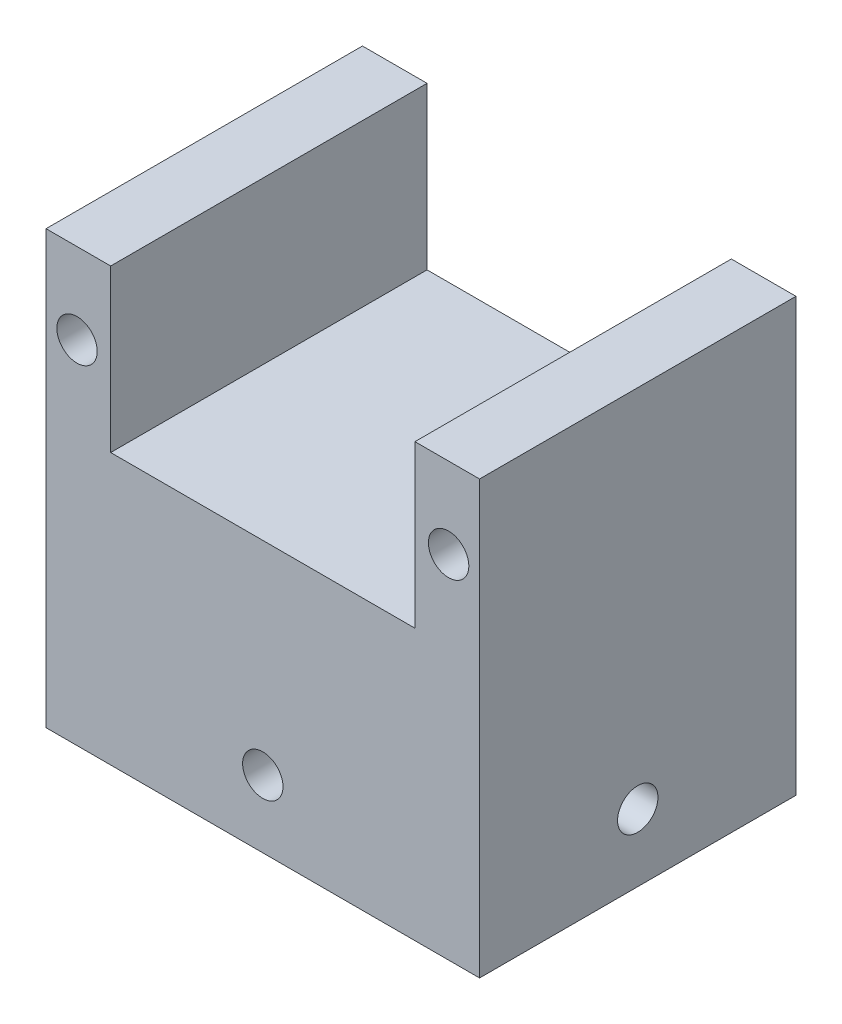
ISO-10303-21;
HEADER;
FILE_DESCRIPTION(('STEP AP214'),'2;1');
FILE_NAME('part.step','',(''),(''),'','','');
FILE_SCHEMA(('AUTOMOTIVE_DESIGN { 1 0 10303 214 1 1 1 1 }'));
ENDSEC;
DATA;
#1=APPLICATION_CONTEXT('core data for automotive mechanical design processes');
#2=APPLICATION_PROTOCOL_DEFINITION('international standard','automotive_design',2000,#1);
#3=PRODUCT_CONTEXT('',#1,'mechanical');
#4=PRODUCT('Part','Part','',(#3));
#5=PRODUCT_RELATED_PRODUCT_CATEGORY('part','',(#4));
#6=PRODUCT_DEFINITION_FORMATION('','',#4);
#7=PRODUCT_DEFINITION_CONTEXT('part definition',#1,'design');
#8=PRODUCT_DEFINITION('design','',#6,#7);
#9=PRODUCT_DEFINITION_SHAPE('','',#8);
#10=(LENGTH_UNIT() NAMED_UNIT(*) SI_UNIT(.MILLI.,.METRE.));
#11=(NAMED_UNIT(*) PLANE_ANGLE_UNIT() SI_UNIT($,.RADIAN.));
#12=(NAMED_UNIT(*) SI_UNIT($,.STERADIAN.) SOLID_ANGLE_UNIT());
#13=UNCERTAINTY_MEASURE_WITH_UNIT(LENGTH_MEASURE(1.E-05),#10,'distance_accuracy_value','');
#14=(GEOMETRIC_REPRESENTATION_CONTEXT(3) GLOBAL_UNCERTAINTY_ASSIGNED_CONTEXT((#13)) GLOBAL_UNIT_ASSIGNED_CONTEXT((#10,
#11,#12)) REPRESENTATION_CONTEXT('',''));
#15=CARTESIAN_POINT('',(0.,0.,0.));
#16=DIRECTION('',(0.,0.,1.));
#17=DIRECTION('',(1.,0.,0.));
#18=AXIS2_PLACEMENT_3D('',#15,#16,#17);
#19=CARTESIAN_POINT('',(5.23104693140794,5.,22.5678700361011));
#20=DIRECTION('',(0.,0.,-1.));
#21=DIRECTION('',(-1.,0.,0.));
#22=AXIS2_PLACEMENT_3D('',#19,#20,#21);
#23=CYLINDRICAL_SURFACE('',#22,1.5);
#24=CARTESIAN_POINT('',(5.23104693140794,5.,-9.53212996389891));
#25=DIRECTION('',(0.,0.,-1.));
#26=DIRECTION('',(-1.,0.,0.));
#27=AXIS2_PLACEMENT_3D('',#24,#25,#26);
#28=CIRCLE('',#27,1.5);
#29=CARTESIAN_POINT('',(3.73104693140794,5.,-9.53212996389891));
#30=VERTEX_POINT('',#29);
#31=EDGE_CURVE('E189',#30,#30,#28,.T.);
#32=ORIENTED_EDGE('',*,*,#31,.T.);
#33=EDGE_LOOP('',(#32));
#34=FACE_BOUND('',#33,.T.);
#35=CARTESIAN_POINT('',(5.23104693140794,5.,2.21787003610109));
#36=DIRECTION('',(0.707106781186547,0.,-0.707106781186547));
#37=DIRECTION('',(-0.707106781186548,0.,-0.707106781186547));
#38=AXIS2_PLACEMENT_3D('',#35,#36,#37);
#39=ELLIPSE('',#38,2.12132034355964,1.5);
#40=CARTESIAN_POINT('',(5.23104693140794,6.5,2.21787003610109));
#41=VERTEX_POINT('',#40);
#42=CARTESIAN_POINT('',(5.23104693140794,3.5,2.21787003610109));
#43=VERTEX_POINT('',#42);
#44=EDGE_CURVE('E46',#41,#43,#39,.F.);
#45=ORIENTED_EDGE('',*,*,#44,.T.);
#46=CARTESIAN_POINT('',(5.23104693140794,5.,2.21787003610109));
#47=DIRECTION('',(-0.707106781186548,0.,-0.707106781186547));
#48=DIRECTION('',(0.707106781186547,0.,-0.707106781186547));
#49=AXIS2_PLACEMENT_3D('',#46,#47,#48);
#50=ELLIPSE('',#49,2.12132034355964,1.5);
#51=EDGE_CURVE('E11',#43,#41,#50,.F.);
#52=ORIENTED_EDGE('',*,*,#51,.T.);
#53=EDGE_LOOP('',(#45,#52));
#54=FACE_BOUND('',#53,.T.);
#55=ADVANCED_FACE('F33',(#34,#54),#23,.F.);
#56=CARTESIAN_POINT('',(0.,32.1,0.));
#57=DIRECTION('',(0.,1.,0.));
#58=DIRECTION('',(0.,0.,1.));
#59=AXIS2_PLACEMENT_3D('',#56,#57,#58);
#60=PLANE('',#59);
#61=DIRECTION('',(0.,0.,-1.));
#62=VECTOR('',#61,1.);
#63=CARTESIAN_POINT('',(16.5310469314079,32.1,0.));
#64=LINE('',#63,#62);
#65=CARTESIAN_POINT('',(16.5310469314079,32.1,13.9678700361011));
#66=VERTEX_POINT('',#65);
#67=CARTESIAN_POINT('',(16.5310469314079,32.1,-9.53212996389891));
#68=VERTEX_POINT('',#67);
#69=EDGE_CURVE('E112',#66,#68,#64,.T.);
#70=ORIENTED_EDGE('',*,*,#69,.F.);
#71=DIRECTION('',(1.,0.,0.));
#72=VECTOR('',#71,1.);
#73=CARTESIAN_POINT('',(-10.8689530685921,32.1,13.9678700361011));
#74=LINE('',#73,#72);
#75=CARTESIAN_POINT('',(21.3310469314079,32.1,13.9678700361011));
#76=VERTEX_POINT('',#75);
#77=EDGE_CURVE('E152',#66,#76,#74,.T.);
#78=ORIENTED_EDGE('',*,*,#77,.T.);
#79=DIRECTION('',(0.,0.,-1.));
#80=VECTOR('',#79,1.);
#81=CARTESIAN_POINT('',(21.3310469314079,32.1,-9.53212996389891));
#82=LINE('',#81,#80);
#83=CARTESIAN_POINT('',(21.3310469314079,32.1,-9.53212996389891));
#84=VERTEX_POINT('',#83);
#85=EDGE_CURVE('E147',#76,#84,#82,.T.);
#86=ORIENTED_EDGE('',*,*,#85,.T.);
#87=DIRECTION('',(-1.,0.,0.));
#88=VECTOR('',#87,1.);
#89=CARTESIAN_POINT('',(-10.8689530685921,32.1,-9.53212996389891));
#90=LINE('',#89,#88);
#91=EDGE_CURVE('E132',#84,#68,#90,.T.);
#92=ORIENTED_EDGE('',*,*,#91,.T.);
#93=EDGE_LOOP('',(#70,#78,#86,#92));
#94=FACE_BOUND('',#93,.T.);
#95=ADVANCED_FACE('F203',(#94),#60,.T.);
#96=CARTESIAN_POINT('',(-10.8689530685921,32.1,-9.53212996389891));
#97=DIRECTION('',(1.,0.,0.));
#98=DIRECTION('',(0.,0.,-1.));
#99=AXIS2_PLACEMENT_3D('',#96,#97,#98);
#100=PLANE('',#99);
#101=CARTESIAN_POINT('',(-10.8689530685921,5.,2.21787003610109));
#102=DIRECTION('',(-1.,0.,0.));
#103=DIRECTION('',(0.,0.,1.));
#104=AXIS2_PLACEMENT_3D('',#101,#102,#103);
#105=CIRCLE('',#104,1.5);
#106=CARTESIAN_POINT('',(-10.8689530685921,5.,3.71787003610109));
#107=VERTEX_POINT('',#106);
#108=EDGE_CURVE('E195',#107,#107,#105,.T.);
#109=ORIENTED_EDGE('',*,*,#108,.F.);
#110=EDGE_LOOP('',(#109));
#111=FACE_BOUND('',#110,.T.);
#112=DIRECTION('',(0.,0.,1.));
#113=VECTOR('',#112,1.);
#114=CARTESIAN_POINT('',(-10.8689530685921,0.,-9.53212996389891));
#115=LINE('',#114,#113);
#116=CARTESIAN_POINT('',(-10.8689530685921,0.,-9.53212996389891));
#117=VERTEX_POINT('',#116);
#118=CARTESIAN_POINT('',(-10.8689530685921,0.,13.9678700361011));
#119=VERTEX_POINT('',#118);
#120=EDGE_CURVE('E140',#117,#119,#115,.T.);
#121=ORIENTED_EDGE('',*,*,#120,.T.);
#122=DIRECTION('',(0.,-1.,0.));
#123=VECTOR('',#122,1.);
#124=CARTESIAN_POINT('',(-10.8689530685921,32.1,13.9678700361011));
#125=LINE('',#124,#123);
#126=CARTESIAN_POINT('',(-10.8689530685921,32.1,13.9678700361011));
#127=VERTEX_POINT('',#126);
#128=EDGE_CURVE('E120',#127,#119,#125,.T.);
#129=ORIENTED_EDGE('',*,*,#128,.F.);
#130=DIRECTION('',(0.,0.,1.));
#131=VECTOR('',#130,1.);
#132=CARTESIAN_POINT('',(-10.8689530685921,32.1,-9.53212996389891));
#133=LINE('',#132,#131);
#134=CARTESIAN_POINT('',(-10.8689530685921,32.1,-9.53212996389891));
#135=VERTEX_POINT('',#134);
#136=EDGE_CURVE('E135',#135,#127,#133,.T.);
#137=ORIENTED_EDGE('',*,*,#136,.F.);
#138=DIRECTION('',(0.,-1.,0.));
#139=VECTOR('',#138,1.);
#140=CARTESIAN_POINT('',(-10.8689530685921,32.1,-9.53212996389891));
#141=LINE('',#140,#139);
#142=EDGE_CURVE('E129',#135,#117,#141,.T.);
#143=ORIENTED_EDGE('',*,*,#142,.T.);
#144=EDGE_LOOP('',(#121,#129,#137,#143));
#145=FACE_BOUND('',#144,.T.);
#146=ADVANCED_FACE('F35',(#111,#145),#100,.F.);
#147=CARTESIAN_POINT('',(-10.8689530685921,32.1,13.9678700361011));
#148=DIRECTION('',(0.,0.,-1.));
#149=DIRECTION('',(-1.,0.,0.));
#150=AXIS2_PLACEMENT_3D('',#147,#148,#149);
#151=PLANE('',#150);
#152=CARTESIAN_POINT('',(5.23104693140794,5.,13.9678700361011));
#153=DIRECTION('',(0.,0.,-1.));
#154=DIRECTION('',(-1.,0.,0.));
#155=AXIS2_PLACEMENT_3D('',#152,#153,#154);
#156=CIRCLE('',#155,1.5);
#157=CARTESIAN_POINT('',(3.73104693140794,5.,13.9678700361011));
#158=VERTEX_POINT('',#157);
#159=EDGE_CURVE('E186',#158,#158,#156,.T.);
#160=ORIENTED_EDGE('',*,*,#159,.T.);
#161=EDGE_LOOP('',(#160));
#162=FACE_BOUND('',#161,.T.);
#163=CARTESIAN_POINT('',(19.0310469314079,26.1,13.9678700361011));
#164=DIRECTION('',(0.,0.,-1.));
#165=DIRECTION('',(-1.,0.,0.));
#166=AXIS2_PLACEMENT_3D('',#163,#164,#165);
#167=CIRCLE('',#166,1.5);
#168=CARTESIAN_POINT('',(17.5310469314079,26.1,13.9678700361011));
#169=VERTEX_POINT('',#168);
#170=EDGE_CURVE('E180',#169,#169,#167,.T.);
#171=ORIENTED_EDGE('',*,*,#170,.T.);
#172=EDGE_LOOP('',(#171));
#173=FACE_BOUND('',#172,.T.);
#174=CARTESIAN_POINT('',(-8.56895306859206,26.1,13.9678700361011));
#175=DIRECTION('',(0.,0.,-1.));
#176=DIRECTION('',(-1.,0.,0.));
#177=AXIS2_PLACEMENT_3D('',#174,#175,#176);
#178=CIRCLE('',#177,1.5);
#179=CARTESIAN_POINT('',(-10.0689530685921,26.1,13.9678700361011));
#180=VERTEX_POINT('',#179);
#181=EDGE_CURVE('E174',#180,#180,#178,.T.);
#182=ORIENTED_EDGE('',*,*,#181,.T.);
#183=EDGE_LOOP('',(#182));
#184=FACE_BOUND('',#183,.T.);
#185=ORIENTED_EDGE('',*,*,#77,.F.);
#186=DIRECTION('',(0.,-1.,0.));
#187=VECTOR('',#186,1.);
#188=CARTESIAN_POINT('',(16.5310469314079,32.1,13.9678700361011));
#189=LINE('',#188,#187);
#190=CARTESIAN_POINT('',(16.5310469314079,20.1,13.9678700361011));
#191=VERTEX_POINT('',#190);
#192=EDGE_CURVE('E157',#66,#191,#189,.T.);
#193=ORIENTED_EDGE('',*,*,#192,.T.);
#194=DIRECTION('',(-1.,0.,0.));
#195=VECTOR('',#194,1.);
#196=CARTESIAN_POINT('',(-10.8689530685921,20.1,13.9678700361011));
#197=LINE('',#196,#195);
#198=CARTESIAN_POINT('',(-6.06895306859206,20.1,13.9678700361011));
#199=VERTEX_POINT('',#198);
#200=EDGE_CURVE('E143',#191,#199,#197,.T.);
#201=ORIENTED_EDGE('',*,*,#200,.T.);
#202=DIRECTION('',(0.,1.,0.));
#203=VECTOR('',#202,1.);
#204=CARTESIAN_POINT('',(-6.06895306859205,32.1,13.9678700361011));
#205=LINE('',#204,#203);
#206=CARTESIAN_POINT('',(-6.06895306859205,32.1,13.9678700361011));
#207=VERTEX_POINT('',#206);
#208=EDGE_CURVE('E160',#199,#207,#205,.T.);
#209=ORIENTED_EDGE('',*,*,#208,.T.);
#210=EDGE_CURVE('E149',#127,#207,#74,.T.);
#211=ORIENTED_EDGE('',*,*,#210,.F.);
#212=ORIENTED_EDGE('',*,*,#128,.T.);
#213=DIRECTION('',(1.,0.,0.));
#214=VECTOR('',#213,1.);
#215=CARTESIAN_POINT('',(-10.8689530685921,0.,13.9678700361011));
#216=LINE('',#215,#214);
#217=CARTESIAN_POINT('',(21.3310469314079,0.,13.9678700361011));
#218=VERTEX_POINT('',#217);
#219=EDGE_CURVE('E138',#119,#218,#216,.T.);
#220=ORIENTED_EDGE('',*,*,#219,.T.);
#221=DIRECTION('',(0.,-1.,0.));
#222=VECTOR('',#221,1.);
#223=CARTESIAN_POINT('',(21.3310469314079,32.1,13.9678700361011));
#224=LINE('',#223,#222);
#225=EDGE_CURVE('E123',#76,#218,#224,.T.);
#226=ORIENTED_EDGE('',*,*,#225,.F.);
#227=EDGE_LOOP('',(#185,#193,#201,#209,#211,#212,#220,#226));
#228=FACE_BOUND('',#227,.T.);
#229=ADVANCED_FACE('F202',(#162,#173,#184,#228),#151,.F.);
#230=CARTESIAN_POINT('',(21.3310469314079,32.1,-9.53212996389891));
#231=DIRECTION('',(-1.,0.,0.));
#232=DIRECTION('',(0.,0.,1.));
#233=AXIS2_PLACEMENT_3D('',#230,#231,#232);
#234=PLANE('',#233);
#235=CARTESIAN_POINT('',(21.3310469314079,5.,2.21787003610108));
#236=DIRECTION('',(-1.,0.,0.));
#237=DIRECTION('',(0.,0.,1.));
#238=AXIS2_PLACEMENT_3D('',#235,#236,#237);
#239=CIRCLE('',#238,1.5);
#240=CARTESIAN_POINT('',(21.3310469314079,5.,3.71787003610108));
#241=VERTEX_POINT('',#240);
#242=EDGE_CURVE('E192',#241,#241,#239,.T.);
#243=ORIENTED_EDGE('',*,*,#242,.T.);
#244=EDGE_LOOP('',(#243));
#245=FACE_BOUND('',#244,.T.);
#246=DIRECTION('',(0.,0.,-1.));
#247=VECTOR('',#246,1.);
#248=CARTESIAN_POINT('',(21.3310469314079,0.,-9.53212996389891));
#249=LINE('',#248,#247);
#250=CARTESIAN_POINT('',(21.3310469314079,0.,-9.53212996389891));
#251=VERTEX_POINT('',#250);
#252=EDGE_CURVE('E136',#218,#251,#249,.T.);
#253=ORIENTED_EDGE('',*,*,#252,.T.);
#254=DIRECTION('',(0.,-1.,0.));
#255=VECTOR('',#254,1.);
#256=CARTESIAN_POINT('',(21.3310469314079,32.1,-9.53212996389891));
#257=LINE('',#256,#255);
#258=EDGE_CURVE('E126',#84,#251,#257,.T.);
#259=ORIENTED_EDGE('',*,*,#258,.F.);
#260=ORIENTED_EDGE('',*,*,#85,.F.);
#261=ORIENTED_EDGE('',*,*,#225,.T.);
#262=EDGE_LOOP('',(#253,#259,#260,#261));
#263=FACE_BOUND('',#262,.T.);
#264=ADVANCED_FACE('F226',(#245,#263),#234,.F.);
#265=CARTESIAN_POINT('',(-10.8689530685921,32.1,-9.53212996389891));
#266=DIRECTION('',(0.,0.,1.));
#267=DIRECTION('',(1.,0.,0.));
#268=AXIS2_PLACEMENT_3D('',#265,#266,#267);
#269=PLANE('',#268);
#270=ORIENTED_EDGE('',*,*,#31,.F.);
#271=EDGE_LOOP('',(#270));
#272=FACE_BOUND('',#271,.T.);
#273=CARTESIAN_POINT('',(19.0310469314079,26.1,-9.53212996389891));
#274=DIRECTION('',(0.,0.,-1.));
#275=DIRECTION('',(-1.,0.,0.));
#276=AXIS2_PLACEMENT_3D('',#273,#274,#275);
#277=CIRCLE('',#276,1.5);
#278=CARTESIAN_POINT('',(17.5310469314079,26.1,-9.53212996389891));
#279=VERTEX_POINT('',#278);
#280=EDGE_CURVE('E183',#279,#279,#277,.T.);
#281=ORIENTED_EDGE('',*,*,#280,.F.);
#282=EDGE_LOOP('',(#281));
#283=FACE_BOUND('',#282,.T.);
#284=CARTESIAN_POINT('',(-8.56895306859206,26.1,-9.53212996389891));
#285=DIRECTION('',(0.,0.,-1.));
#286=DIRECTION('',(-1.,0.,0.));
#287=AXIS2_PLACEMENT_3D('',#284,#285,#286);
#288=CIRCLE('',#287,1.5);
#289=CARTESIAN_POINT('',(-10.0689530685921,26.1,-9.53212996389891));
#290=VERTEX_POINT('',#289);
#291=EDGE_CURVE('E177',#290,#290,#288,.T.);
#292=ORIENTED_EDGE('',*,*,#291,.F.);
#293=EDGE_LOOP('',(#292));
#294=FACE_BOUND('',#293,.T.);
#295=DIRECTION('',(-1.,0.,0.));
#296=VECTOR('',#295,1.);
#297=CARTESIAN_POINT('',(16.5310469314079,20.1,-9.53212996389891));
#298=LINE('',#297,#296);
#299=CARTESIAN_POINT('',(16.5310469314079,20.1,-9.53212996389891));
#300=VERTEX_POINT('',#299);
#301=CARTESIAN_POINT('',(-6.06895306859206,20.1,-9.53212996389891));
#302=VERTEX_POINT('',#301);
#303=EDGE_CURVE('E168',#300,#302,#298,.T.);
#304=ORIENTED_EDGE('',*,*,#303,.F.);
#305=DIRECTION('',(0.,-1.,0.));
#306=VECTOR('',#305,1.);
#307=CARTESIAN_POINT('',(16.5310469314079,32.1,-9.53212996389891));
#308=LINE('',#307,#306);
#309=EDGE_CURVE('E171',#68,#300,#308,.T.);
#310=ORIENTED_EDGE('',*,*,#309,.F.);
#311=ORIENTED_EDGE('',*,*,#91,.F.);
#312=ORIENTED_EDGE('',*,*,#258,.T.);
#313=DIRECTION('',(-1.,0.,0.));
#314=VECTOR('',#313,1.);
#315=CARTESIAN_POINT('',(-10.8689530685921,0.,-9.53212996389891));
#316=LINE('',#315,#314);
#317=EDGE_CURVE('E133',#251,#117,#316,.T.);
#318=ORIENTED_EDGE('',*,*,#317,.T.);
#319=ORIENTED_EDGE('',*,*,#142,.F.);
#320=CARTESIAN_POINT('',(-6.06895306859206,32.1,-9.53212996389891));
#321=VERTEX_POINT('',#320);
#322=EDGE_CURVE('E146',#321,#135,#90,.T.);
#323=ORIENTED_EDGE('',*,*,#322,.F.);
#324=DIRECTION('',(0.,1.,0.));
#325=VECTOR('',#324,1.);
#326=CARTESIAN_POINT('',(-6.06895306859205,32.1,-9.53212996389891));
#327=LINE('',#326,#325);
#328=EDGE_CURVE('E54',#302,#321,#327,.T.);
#329=ORIENTED_EDGE('',*,*,#328,.F.);
#330=EDGE_LOOP('',(#304,#310,#311,#312,#318,#319,#323,#329));
#331=FACE_BOUND('',#330,.T.);
#332=ADVANCED_FACE('F220',(#272,#283,#294,#331),#269,.F.);
#333=DIRECTION('',(0.,0.,1.));
#334=VECTOR('',#333,1.);
#335=CARTESIAN_POINT('',(-6.06895306859205,32.1,0.));
#336=LINE('',#335,#334);
#337=EDGE_CURVE('E118',#321,#207,#336,.T.);
#338=ORIENTED_EDGE('',*,*,#337,.F.);
#339=ORIENTED_EDGE('',*,*,#322,.T.);
#340=ORIENTED_EDGE('',*,*,#136,.T.);
#341=ORIENTED_EDGE('',*,*,#210,.T.);
#342=EDGE_LOOP('',(#338,#339,#340,#341));
#343=FACE_BOUND('',#342,.T.);
#344=ADVANCED_FACE('F216',(#343),#60,.T.);
#345=CARTESIAN_POINT('',(0.,0.,0.));
#346=DIRECTION('',(0.,1.,0.));
#347=DIRECTION('',(0.,0.,1.));
#348=AXIS2_PLACEMENT_3D('',#345,#346,#347);
#349=PLANE('',#348);
#350=ORIENTED_EDGE('',*,*,#120,.F.);
#351=ORIENTED_EDGE('',*,*,#317,.F.);
#352=ORIENTED_EDGE('',*,*,#252,.F.);
#353=ORIENTED_EDGE('',*,*,#219,.F.);
#354=EDGE_LOOP('',(#350,#351,#352,#353));
#355=FACE_BOUND('',#354,.T.);
#356=ADVANCED_FACE('F210',(#355),#349,.F.);
#357=CARTESIAN_POINT('',(16.5310469314079,20.1,22.5678700361011));
#358=DIRECTION('',(0.,-1.,0.));
#359=DIRECTION('',(1.,0.,0.));
#360=AXIS2_PLACEMENT_3D('',#357,#358,#359);
#361=PLANE('',#360);
#362=DIRECTION('',(0.,0.,-1.));
#363=VECTOR('',#362,1.);
#364=CARTESIAN_POINT('',(16.5310469314079,20.1,22.5678700361011));
#365=LINE('',#364,#363);
#366=EDGE_CURVE('E164',#191,#300,#365,.T.);
#367=ORIENTED_EDGE('',*,*,#366,.T.);
#368=ORIENTED_EDGE('',*,*,#303,.T.);
#369=DIRECTION('',(0.,0.,-1.));
#370=VECTOR('',#369,1.);
#371=CARTESIAN_POINT('',(-6.06895306859206,20.1,22.5678700361011));
#372=LINE('',#371,#370);
#373=EDGE_CURVE('E163',#199,#302,#372,.T.);
#374=ORIENTED_EDGE('',*,*,#373,.F.);
#375=ORIENTED_EDGE('',*,*,#200,.F.);
#376=EDGE_LOOP('',(#367,#368,#374,#375));
#377=FACE_BOUND('',#376,.T.);
#378=ADVANCED_FACE('F234',(#377),#361,.F.);
#379=CARTESIAN_POINT('',(16.5310469314079,32.1,22.5678700361011));
#380=DIRECTION('',(1.,0.,0.));
#381=DIRECTION('',(0.,0.,-1.));
#382=AXIS2_PLACEMENT_3D('',#379,#380,#381);
#383=PLANE('',#382);
#384=ORIENTED_EDGE('',*,*,#69,.T.);
#385=ORIENTED_EDGE('',*,*,#309,.T.);
#386=ORIENTED_EDGE('',*,*,#366,.F.);
#387=ORIENTED_EDGE('',*,*,#192,.F.);
#388=EDGE_LOOP('',(#384,#385,#386,#387));
#389=FACE_BOUND('',#388,.T.);
#390=ADVANCED_FACE('F230',(#389),#383,.F.);
#391=CARTESIAN_POINT('',(-6.06895306859205,32.1,22.5678700361011));
#392=DIRECTION('',(-1.,0.,0.));
#393=DIRECTION('',(0.,-1.,0.));
#394=AXIS2_PLACEMENT_3D('',#391,#392,#393);
#395=PLANE('',#394);
#396=ORIENTED_EDGE('',*,*,#373,.T.);
#397=ORIENTED_EDGE('',*,*,#328,.T.);
#398=ORIENTED_EDGE('',*,*,#337,.T.);
#399=ORIENTED_EDGE('',*,*,#208,.F.);
#400=EDGE_LOOP('',(#396,#397,#398,#399));
#401=FACE_BOUND('',#400,.T.);
#402=ADVANCED_FACE('F235',(#401),#395,.F.);
#403=CARTESIAN_POINT('',(-8.56895306859206,26.1,22.5678700361011));
#404=DIRECTION('',(0.,0.,-1.));
#405=DIRECTION('',(-1.,0.,0.));
#406=AXIS2_PLACEMENT_3D('',#403,#404,#405);
#407=CYLINDRICAL_SURFACE('',#406,1.5);
#408=ORIENTED_EDGE('',*,*,#291,.T.);
#409=EDGE_LOOP('',(#408));
#410=FACE_BOUND('',#409,.T.);
#411=ORIENTED_EDGE('',*,*,#181,.F.);
#412=EDGE_LOOP('',(#411));
#413=FACE_BOUND('',#412,.T.);
#414=ADVANCED_FACE('F237',(#410,#413),#407,.F.);
#415=CARTESIAN_POINT('',(19.0310469314079,26.1,22.5678700361011));
#416=DIRECTION('',(0.,0.,-1.));
#417=DIRECTION('',(-1.,0.,0.));
#418=AXIS2_PLACEMENT_3D('',#415,#416,#417);
#419=CYLINDRICAL_SURFACE('',#418,1.5);
#420=ORIENTED_EDGE('',*,*,#280,.T.);
#421=EDGE_LOOP('',(#420));
#422=FACE_BOUND('',#421,.T.);
#423=ORIENTED_EDGE('',*,*,#170,.F.);
#424=EDGE_LOOP('',(#423));
#425=FACE_BOUND('',#424,.T.);
#426=ADVANCED_FACE('F243',(#422,#425),#419,.F.);
#427=CARTESIAN_POINT('',(5.23104693140794,5.,2.21787003610109));
#428=DIRECTION('',(0.707106781186547,0.,-0.707106781186547));
#429=DIRECTION('',(-0.707106781186548,0.,-0.707106781186547));
#430=AXIS2_PLACEMENT_3D('',#427,#428,#429);
#431=ELLIPSE('',#430,2.12132034355964,1.5);
#432=EDGE_CURVE('E104',#41,#43,#431,.T.);
#433=ORIENTED_EDGE('',*,*,#432,.T.);
#434=CARTESIAN_POINT('',(5.23104693140794,5.,2.21787003610109));
#435=DIRECTION('',(-0.707106781186548,0.,-0.707106781186547));
#436=DIRECTION('',(0.707106781186547,0.,-0.707106781186547));
#437=AXIS2_PLACEMENT_3D('',#434,#435,#436);
#438=ELLIPSE('',#437,2.12132034355964,1.5);
#439=EDGE_CURVE('E41',#43,#41,#438,.T.);
#440=ORIENTED_EDGE('',*,*,#439,.T.);
#441=EDGE_LOOP('',(#433,#440));
#442=FACE_BOUND('',#441,.T.);
#443=ORIENTED_EDGE('',*,*,#159,.F.);
#444=EDGE_LOOP('',(#443));
#445=FACE_BOUND('',#444,.T.);
#446=ADVANCED_FACE('F114',(#442,#445),#23,.F.);
#447=CARTESIAN_POINT('',(25.2310469314079,5.,2.21787003610108));
#448=DIRECTION('',(-1.,0.,0.));
#449=DIRECTION('',(0.,0.,1.));
#450=AXIS2_PLACEMENT_3D('',#447,#448,#449);
#451=CYLINDRICAL_SURFACE('',#450,1.5);
#452=ORIENTED_EDGE('',*,*,#108,.T.);
#453=EDGE_LOOP('',(#452));
#454=FACE_BOUND('',#453,.T.);
#455=ORIENTED_EDGE('',*,*,#44,.F.);
#456=ORIENTED_EDGE('',*,*,#439,.F.);
#457=EDGE_LOOP('',(#455,#456));
#458=FACE_BOUND('',#457,.T.);
#459=ADVANCED_FACE('F111',(#454,#458),#451,.F.);
#460=ORIENTED_EDGE('',*,*,#432,.F.);
#461=ORIENTED_EDGE('',*,*,#51,.F.);
#462=EDGE_LOOP('',(#460,#461));
#463=FACE_BOUND('',#462,.T.);
#464=ORIENTED_EDGE('',*,*,#242,.F.);
#465=EDGE_LOOP('',(#464));
#466=FACE_BOUND('',#465,.T.);
#467=ADVANCED_FACE('F105',(#463,#466),#451,.F.);
#468=CLOSED_SHELL('',(#55,#95,#146,#229,#264,#332,#344,#356,#378,#390,#402,#414,#426,#446,#459,#467));
#469=MANIFOLD_SOLID_BREP('B2',#468);
#470=ADVANCED_BREP_SHAPE_REPRESENTATION('',(#18,#469),#14);
#471=SHAPE_DEFINITION_REPRESENTATION(#9,#470);
ENDSEC;
END-ISO-10303-21;
